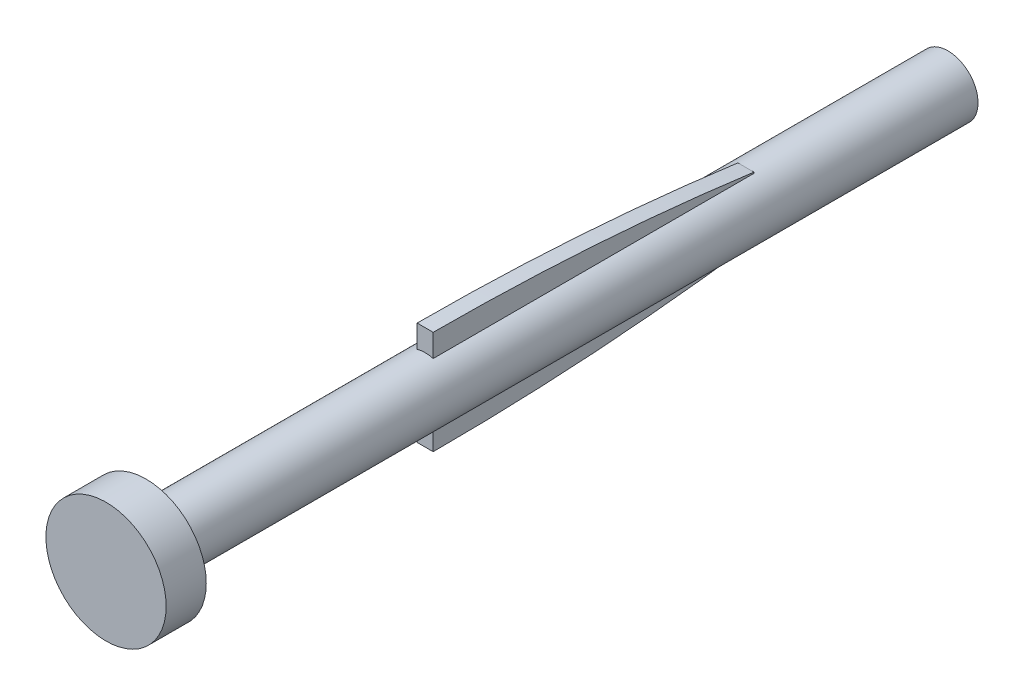
ISO-10303-21;
HEADER;
FILE_DESCRIPTION(('STEP AP214'),'2;1');
FILE_NAME('part.step','',(''),(''),'','','');
FILE_SCHEMA(('AUTOMOTIVE_DESIGN { 1 0 10303 214 1 1 1 1 }'));
ENDSEC;
DATA;
#1=APPLICATION_CONTEXT('core data for automotive mechanical design processes');
#2=APPLICATION_PROTOCOL_DEFINITION('international standard','automotive_design',2000,#1);
#3=PRODUCT_CONTEXT('',#1,'mechanical');
#4=PRODUCT('Part','Part','',(#3));
#5=PRODUCT_RELATED_PRODUCT_CATEGORY('part','',(#4));
#6=PRODUCT_DEFINITION_FORMATION('','',#4);
#7=PRODUCT_DEFINITION_CONTEXT('part definition',#1,'design');
#8=PRODUCT_DEFINITION('design','',#6,#7);
#9=PRODUCT_DEFINITION_SHAPE('','',#8);
#10=(LENGTH_UNIT() NAMED_UNIT(*) SI_UNIT(.MILLI.,.METRE.));
#11=(NAMED_UNIT(*) PLANE_ANGLE_UNIT() SI_UNIT($,.RADIAN.));
#12=(NAMED_UNIT(*) SI_UNIT($,.STERADIAN.) SOLID_ANGLE_UNIT());
#13=UNCERTAINTY_MEASURE_WITH_UNIT(LENGTH_MEASURE(1.E-05),#10,'distance_accuracy_value','');
#14=(GEOMETRIC_REPRESENTATION_CONTEXT(3) GLOBAL_UNCERTAINTY_ASSIGNED_CONTEXT((#13)) GLOBAL_UNIT_ASSIGNED_CONTEXT((#10,
#11,#12)) REPRESENTATION_CONTEXT('',''));
#15=CARTESIAN_POINT('',(0.,0.,0.));
#16=DIRECTION('',(0.,0.,1.));
#17=DIRECTION('',(1.,0.,0.));
#18=AXIS2_PLACEMENT_3D('',#15,#16,#17);
#19=CARTESIAN_POINT('',(0.,0.,6.35));
#20=DIRECTION('',(0.,0.,-1.));
#21=DIRECTION('',(-1.,0.,0.));
#22=AXIS2_PLACEMENT_3D('',#19,#20,#21);
#23=CYLINDRICAL_SURFACE('',#22,9.525);
#24=CARTESIAN_POINT('',(0.,0.,6.35));
#25=DIRECTION('',(0.,0.,1.));
#26=DIRECTION('',(1.,0.,0.));
#27=AXIS2_PLACEMENT_3D('',#24,#25,#26);
#28=CIRCLE('',#27,9.525);
#29=CARTESIAN_POINT('',(9.525,0.,6.35));
#30=VERTEX_POINT('',#29);
#31=EDGE_CURVE('E187',#30,#30,#28,.T.);
#32=ORIENTED_EDGE('',*,*,#31,.F.);
#33=EDGE_LOOP('',(#32));
#34=FACE_BOUND('',#33,.T.);
#35=CARTESIAN_POINT('',(0.,0.,0.));
#36=DIRECTION('',(0.,0.,1.));
#37=DIRECTION('',(1.,0.,0.));
#38=AXIS2_PLACEMENT_3D('',#35,#36,#37);
#39=CIRCLE('',#38,9.525);
#40=CARTESIAN_POINT('',(9.525,0.,0.));
#41=VERTEX_POINT('',#40);
#42=EDGE_CURVE('E181',#41,#41,#39,.T.);
#43=ORIENTED_EDGE('',*,*,#42,.T.);
#44=EDGE_LOOP('',(#43));
#45=FACE_BOUND('',#44,.T.);
#46=ADVANCED_FACE('F39',(#34,#45),#23,.T.);
#47=CARTESIAN_POINT('',(0.,0.,6.35));
#48=DIRECTION('',(0.,0.,1.));
#49=DIRECTION('',(1.,0.,0.));
#50=AXIS2_PLACEMENT_3D('',#47,#48,#49);
#51=PLANE('',#50);
#52=ORIENTED_EDGE('',*,*,#31,.T.);
#53=EDGE_LOOP('',(#52));
#54=FACE_BOUND('',#53,.T.);
#55=ADVANCED_FACE('F260',(#54),#51,.T.);
#56=CARTESIAN_POINT('',(0.,0.,0.));
#57=DIRECTION('',(0.,0.,1.));
#58=DIRECTION('',(1.,0.,0.));
#59=AXIS2_PLACEMENT_3D('',#56,#57,#58);
#60=PLANE('',#59);
#61=CARTESIAN_POINT('',(0.,0.,0.));
#62=DIRECTION('',(0.,0.,-1.));
#63=DIRECTION('',(-1.,0.,0.));
#64=AXIS2_PLACEMENT_3D('',#61,#62,#63);
#65=CIRCLE('',#64,4.7625);
#66=CARTESIAN_POINT('',(-4.7625,0.,0.));
#67=VERTEX_POINT('',#66);
#68=EDGE_CURVE('E182',#67,#67,#65,.T.);
#69=ORIENTED_EDGE('',*,*,#68,.F.);
#70=EDGE_LOOP('',(#69));
#71=FACE_BOUND('',#70,.T.);
#72=ORIENTED_EDGE('',*,*,#42,.F.);
#73=EDGE_LOOP('',(#72));
#74=FACE_BOUND('',#73,.T.);
#75=ADVANCED_FACE('F265',(#71,#74),#60,.F.);
#76=CARTESIAN_POINT('',(0.,0.,-127.));
#77=DIRECTION('',(0.,0.,1.));
#78=DIRECTION('',(1.,0.,0.));
#79=AXIS2_PLACEMENT_3D('',#76,#77,#78);
#80=CYLINDRICAL_SURFACE('',#79,4.7625);
#81=CARTESIAN_POINT('',(0.,0.,-94.996));
#82=DIRECTION('',(0.,0.,-1.));
#83=DIRECTION('',(-1.,0.,0.));
#84=AXIS2_PLACEMENT_3D('',#81,#82,#83);
#85=CIRCLE('',#84,4.7625);
#86=CARTESIAN_POINT('',(1.27,-4.5900442535993,-94.996));
#87=VERTEX_POINT('',#86);
#88=CARTESIAN_POINT('',(0.,-4.7625,-94.996));
#89=VERTEX_POINT('',#88);
#90=EDGE_CURVE('E49',#87,#89,#85,.T.);
#91=ORIENTED_EDGE('',*,*,#90,.T.);
#92=CARTESIAN_POINT('',(-1.27,-4.5900442535993,-94.996));
#93=VERTEX_POINT('',#92);
#94=EDGE_CURVE('E11',#89,#93,#85,.T.);
#95=ORIENTED_EDGE('',*,*,#94,.T.);
#96=DIRECTION('',(0.,0.,1.));
#97=VECTOR('',#96,1.);
#98=CARTESIAN_POINT('',(-1.27,-4.5900442535993,-127.));
#99=LINE('',#98,#97);
#100=CARTESIAN_POINT('',(-1.27,-4.5900442535993,-44.196));
#101=VERTEX_POINT('',#100);
#102=EDGE_CURVE('E42',#93,#101,#99,.T.);
#103=ORIENTED_EDGE('',*,*,#102,.T.);
#104=CARTESIAN_POINT('',(0.,0.,-44.196));
#105=DIRECTION('',(0.,0.,1.));
#106=DIRECTION('',(0.,-1.,0.));
#107=AXIS2_PLACEMENT_3D('',#104,#105,#106);
#108=CIRCLE('',#107,4.7625);
#109=CARTESIAN_POINT('',(1.27,-4.5900442535993,-44.196));
#110=VERTEX_POINT('',#109);
#111=EDGE_CURVE('E197',#101,#110,#108,.T.);
#112=ORIENTED_EDGE('',*,*,#111,.T.);
#113=DIRECTION('',(0.,0.,1.));
#114=VECTOR('',#113,1.);
#115=CARTESIAN_POINT('',(1.27,-4.5900442535993,-127.));
#116=LINE('',#115,#114);
#117=EDGE_CURVE('E203',#87,#110,#116,.T.);
#118=ORIENTED_EDGE('',*,*,#117,.F.);
#119=EDGE_LOOP('',(#91,#95,#103,#112,#118));
#120=FACE_BOUND('',#119,.T.);
#121=CARTESIAN_POINT('',(1.27,4.5900442535993,-44.196));
#122=VERTEX_POINT('',#121);
#123=CARTESIAN_POINT('',(-1.27,4.5900442535993,-44.196));
#124=VERTEX_POINT('',#123);
#125=EDGE_CURVE('E128',#122,#124,#108,.T.);
#126=ORIENTED_EDGE('',*,*,#125,.T.);
#127=DIRECTION('',(0.,0.,1.));
#128=VECTOR('',#127,1.);
#129=CARTESIAN_POINT('',(-1.27,4.5900442535993,-127.));
#130=LINE('',#129,#128);
#131=CARTESIAN_POINT('',(-1.27,4.5900442535993,-94.996));
#132=VERTEX_POINT('',#131);
#133=EDGE_CURVE('E201',#124,#132,#130,.F.);
#134=ORIENTED_EDGE('',*,*,#133,.T.);
#135=CARTESIAN_POINT('',(0.,4.7625,-94.996));
#136=VERTEX_POINT('',#135);
#137=EDGE_CURVE('E200',#132,#136,#85,.T.);
#138=ORIENTED_EDGE('',*,*,#137,.T.);
#139=CARTESIAN_POINT('',(1.27,4.5900442535993,-94.996));
#140=VERTEX_POINT('',#139);
#141=EDGE_CURVE('E50',#136,#140,#85,.T.);
#142=ORIENTED_EDGE('',*,*,#141,.T.);
#143=DIRECTION('',(0.,0.,1.));
#144=VECTOR('',#143,1.);
#145=CARTESIAN_POINT('',(1.27,4.5900442535993,-127.));
#146=LINE('',#145,#144);
#147=EDGE_CURVE('E186',#122,#140,#146,.F.);
#148=ORIENTED_EDGE('',*,*,#147,.F.);
#149=EDGE_LOOP('',(#126,#134,#138,#142,#148));
#150=FACE_BOUND('',#149,.T.);
#151=CARTESIAN_POINT('',(0.,0.,-127.));
#152=DIRECTION('',(0.,0.,-1.));
#153=DIRECTION('',(-1.,0.,0.));
#154=AXIS2_PLACEMENT_3D('',#151,#152,#153);
#155=CIRCLE('',#154,4.7625);
#156=CARTESIAN_POINT('',(-4.7625,0.,-127.));
#157=VERTEX_POINT('',#156);
#158=EDGE_CURVE('E168',#157,#157,#155,.T.);
#159=ORIENTED_EDGE('',*,*,#158,.F.);
#160=EDGE_LOOP('',(#159));
#161=FACE_BOUND('',#160,.T.);
#162=ORIENTED_EDGE('',*,*,#68,.T.);
#163=EDGE_LOOP('',(#162));
#164=FACE_BOUND('',#163,.T.);
#165=ADVANCED_FACE('F216',(#120,#150,#161,#164),#80,.T.);
#166=CARTESIAN_POINT('',(0.,0.,-127.));
#167=DIRECTION('',(0.,0.,-1.));
#168=DIRECTION('',(-1.,0.,0.));
#169=AXIS2_PLACEMENT_3D('',#166,#167,#168);
#170=PLANE('',#169);
#171=ORIENTED_EDGE('',*,*,#158,.T.);
#172=EDGE_LOOP('',(#171));
#173=FACE_BOUND('',#172,.T.);
#174=ADVANCED_FACE('F277',(#173),#170,.T.);
#175=CARTESIAN_POINT('',(-1.27,-369.819296296295,-44.196));
#176=DIRECTION('',(1.,0.,0.));
#177=DIRECTION('',(0.,0.,-1.));
#178=AXIS2_PLACEMENT_3D('',#175,#176,#177);
#179=CYLINDRICAL_SURFACE('',#178,378.010796296295);
#180=DIRECTION('',(1.,0.,0.));
#181=VECTOR('',#180,1.);
#182=CARTESIAN_POINT('',(-1.27,8.1915,-44.196));
#183=LINE('',#182,#181);
#184=CARTESIAN_POINT('',(-1.27,8.1915,-44.196));
#185=VERTEX_POINT('',#184);
#186=CARTESIAN_POINT('',(1.27,8.1915,-44.196));
#187=VERTEX_POINT('',#186);
#188=EDGE_CURVE('E108',#185,#187,#183,.T.);
#189=ORIENTED_EDGE('',*,*,#188,.T.);
#190=CARTESIAN_POINT('',(1.27,-369.819296296295,-44.196));
#191=DIRECTION('',(1.,0.,0.));
#192=DIRECTION('',(0.,0.,1.));
#193=AXIS2_PLACEMENT_3D('',#190,#191,#192);
#194=CIRCLE('',#193,378.010796296295);
#195=CARTESIAN_POINT('',(1.27,4.7625,-94.996));
#196=VERTEX_POINT('',#195);
#197=EDGE_CURVE('E113',#196,#187,#194,.T.);
#198=ORIENTED_EDGE('',*,*,#197,.F.);
#199=DIRECTION('',(1.,0.,0.));
#200=VECTOR('',#199,1.);
#201=CARTESIAN_POINT('',(-1.27,4.7625,-94.996));
#202=LINE('',#201,#200);
#203=EDGE_CURVE('E169',#136,#196,#202,.T.);
#204=ORIENTED_EDGE('',*,*,#203,.F.);
#205=CARTESIAN_POINT('',(-1.27,4.7625,-94.996));
#206=VERTEX_POINT('',#205);
#207=EDGE_CURVE('E164',#206,#136,#202,.T.);
#208=ORIENTED_EDGE('',*,*,#207,.F.);
#209=CARTESIAN_POINT('',(-1.27,-369.819296296295,-44.196));
#210=DIRECTION('',(1.,0.,0.));
#211=DIRECTION('',(0.,0.,1.));
#212=AXIS2_PLACEMENT_3D('',#209,#210,#211);
#213=CIRCLE('',#212,378.010796296295);
#214=EDGE_CURVE('E116',#206,#185,#213,.T.);
#215=ORIENTED_EDGE('',*,*,#214,.T.);
#216=EDGE_LOOP('',(#189,#198,#204,#208,#215));
#217=FACE_BOUND('',#216,.T.);
#218=ADVANCED_FACE('F110',(#217),#179,.T.);
#219=CARTESIAN_POINT('',(-1.27,-369.819296296295,-44.196));
#220=DIRECTION('',(-1.,0.,0.));
#221=DIRECTION('',(0.,0.,1.));
#222=AXIS2_PLACEMENT_3D('',#219,#220,#221);
#223=PLANE('',#222);
#224=ORIENTED_EDGE('',*,*,#133,.F.);
#225=DIRECTION('',(0.,-1.,0.));
#226=VECTOR('',#225,1.);
#227=CARTESIAN_POINT('',(-1.27,4.7625,-44.196));
#228=LINE('',#227,#226);
#229=EDGE_CURVE('E153',#185,#124,#228,.T.);
#230=ORIENTED_EDGE('',*,*,#229,.F.);
#231=ORIENTED_EDGE('',*,*,#214,.F.);
#232=DIRECTION('',(0.,1.,0.));
#233=VECTOR('',#232,1.);
#234=CARTESIAN_POINT('',(-1.27,4.7625,-94.996));
#235=LINE('',#234,#233);
#236=EDGE_CURVE('E160',#132,#206,#235,.T.);
#237=ORIENTED_EDGE('',*,*,#236,.F.);
#238=EDGE_LOOP('',(#224,#230,#231,#237));
#239=FACE_BOUND('',#238,.T.);
#240=ADVANCED_FACE('F255',(#239),#223,.T.);
#241=CARTESIAN_POINT('',(1.27,-369.819296296295,-44.196));
#242=DIRECTION('',(-1.,0.,0.));
#243=DIRECTION('',(0.,0.,1.));
#244=AXIS2_PLACEMENT_3D('',#241,#242,#243);
#245=PLANE('',#244);
#246=DIRECTION('',(0.,-1.,0.));
#247=VECTOR('',#246,1.);
#248=CARTESIAN_POINT('',(1.27,4.7625,-44.196));
#249=LINE('',#248,#247);
#250=EDGE_CURVE('E126',#187,#122,#249,.T.);
#251=ORIENTED_EDGE('',*,*,#250,.T.);
#252=ORIENTED_EDGE('',*,*,#147,.T.);
#253=DIRECTION('',(0.,1.,0.));
#254=VECTOR('',#253,1.);
#255=CARTESIAN_POINT('',(1.27,4.7625,-94.996));
#256=LINE('',#255,#254);
#257=EDGE_CURVE('E138',#140,#196,#256,.T.);
#258=ORIENTED_EDGE('',*,*,#257,.T.);
#259=ORIENTED_EDGE('',*,*,#197,.T.);
#260=EDGE_LOOP('',(#251,#252,#258,#259));
#261=FACE_BOUND('',#260,.T.);
#262=ADVANCED_FACE('F136',(#261),#245,.F.);
#263=CARTESIAN_POINT('',(-1.27,-4.7625,-44.196));
#264=DIRECTION('',(0.,0.,1.));
#265=DIRECTION('',(0.,-1.,0.));
#266=AXIS2_PLACEMENT_3D('',#263,#264,#265);
#267=PLANE('',#266);
#268=ORIENTED_EDGE('',*,*,#125,.F.);
#269=ORIENTED_EDGE('',*,*,#250,.F.);
#270=ORIENTED_EDGE('',*,*,#188,.F.);
#271=ORIENTED_EDGE('',*,*,#229,.T.);
#272=EDGE_LOOP('',(#268,#269,#270,#271));
#273=FACE_BOUND('',#272,.T.);
#274=ADVANCED_FACE('F127',(#273),#267,.T.);
#275=CARTESIAN_POINT('',(-1.27,4.7625,-94.996));
#276=DIRECTION('',(0.,0.,-1.));
#277=DIRECTION('',(-1.,0.,0.));
#278=AXIS2_PLACEMENT_3D('',#275,#276,#277);
#279=PLANE('',#278);
#280=ORIENTED_EDGE('',*,*,#141,.F.);
#281=ORIENTED_EDGE('',*,*,#203,.T.);
#282=ORIENTED_EDGE('',*,*,#257,.F.);
#283=EDGE_LOOP('',(#280,#281,#282));
#284=FACE_BOUND('',#283,.T.);
#285=ADVANCED_FACE('F222',(#284),#279,.T.);
#286=ORIENTED_EDGE('',*,*,#137,.F.);
#287=ORIENTED_EDGE('',*,*,#236,.T.);
#288=ORIENTED_EDGE('',*,*,#207,.T.);
#289=EDGE_LOOP('',(#286,#287,#288));
#290=FACE_BOUND('',#289,.T.);
#291=ADVANCED_FACE('F224',(#290),#279,.T.);
#292=ORIENTED_EDGE('',*,*,#90,.F.);
#293=CARTESIAN_POINT('',(1.27,-4.7625,-94.996));
#294=VERTEX_POINT('',#293);
#295=EDGE_CURVE('E146',#294,#87,#256,.T.);
#296=ORIENTED_EDGE('',*,*,#295,.F.);
#297=DIRECTION('',(1.,0.,0.));
#298=VECTOR('',#297,1.);
#299=CARTESIAN_POINT('',(-1.27,-4.7625,-94.996));
#300=LINE('',#299,#298);
#301=EDGE_CURVE('E174',#89,#294,#300,.T.);
#302=ORIENTED_EDGE('',*,*,#301,.F.);
#303=EDGE_LOOP('',(#292,#296,#302));
#304=FACE_BOUND('',#303,.T.);
#305=ADVANCED_FACE('F247',(#304),#279,.T.);
#306=ORIENTED_EDGE('',*,*,#102,.F.);
#307=CARTESIAN_POINT('',(-1.27,-4.7625,-94.996));
#308=VERTEX_POINT('',#307);
#309=EDGE_CURVE('E122',#308,#93,#235,.T.);
#310=ORIENTED_EDGE('',*,*,#309,.F.);
#311=CARTESIAN_POINT('',(-1.27,369.819296296295,-44.196));
#312=DIRECTION('',(1.,0.,0.));
#313=DIRECTION('',(0.,0.,-1.));
#314=AXIS2_PLACEMENT_3D('',#311,#312,#313);
#315=CIRCLE('',#314,378.010796296295);
#316=CARTESIAN_POINT('',(-1.27,-8.1915,-44.196));
#317=VERTEX_POINT('',#316);
#318=EDGE_CURVE('E156',#317,#308,#315,.T.);
#319=ORIENTED_EDGE('',*,*,#318,.F.);
#320=EDGE_CURVE('E152',#101,#317,#228,.T.);
#321=ORIENTED_EDGE('',*,*,#320,.F.);
#322=EDGE_LOOP('',(#306,#310,#319,#321));
#323=FACE_BOUND('',#322,.T.);
#324=ADVANCED_FACE('F239',(#323),#223,.T.);
#325=ORIENTED_EDGE('',*,*,#295,.T.);
#326=ORIENTED_EDGE('',*,*,#117,.T.);
#327=CARTESIAN_POINT('',(1.27,-8.1915,-44.196));
#328=VERTEX_POINT('',#327);
#329=EDGE_CURVE('E133',#110,#328,#249,.T.);
#330=ORIENTED_EDGE('',*,*,#329,.T.);
#331=CARTESIAN_POINT('',(1.27,369.819296296295,-44.196));
#332=DIRECTION('',(1.,0.,0.));
#333=DIRECTION('',(0.,0.,-1.));
#334=AXIS2_PLACEMENT_3D('',#331,#332,#333);
#335=CIRCLE('',#334,378.010796296295);
#336=EDGE_CURVE('E132',#328,#294,#335,.T.);
#337=ORIENTED_EDGE('',*,*,#336,.T.);
#338=EDGE_LOOP('',(#325,#326,#330,#337));
#339=FACE_BOUND('',#338,.T.);
#340=ADVANCED_FACE('F246',(#339),#245,.F.);
#341=ORIENTED_EDGE('',*,*,#94,.F.);
#342=EDGE_CURVE('E170',#308,#89,#300,.T.);
#343=ORIENTED_EDGE('',*,*,#342,.F.);
#344=ORIENTED_EDGE('',*,*,#309,.T.);
#345=EDGE_LOOP('',(#341,#343,#344));
#346=FACE_BOUND('',#345,.T.);
#347=ADVANCED_FACE('F241',(#346),#279,.T.);
#348=CARTESIAN_POINT('',(-1.27,369.819296296295,-44.196));
#349=DIRECTION('',(1.,0.,0.));
#350=DIRECTION('',(0.,0.,-1.));
#351=AXIS2_PLACEMENT_3D('',#348,#349,#350);
#352=CYLINDRICAL_SURFACE('',#351,378.010796296295);
#353=ORIENTED_EDGE('',*,*,#342,.T.);
#354=ORIENTED_EDGE('',*,*,#301,.T.);
#355=ORIENTED_EDGE('',*,*,#336,.F.);
#356=DIRECTION('',(1.,0.,0.));
#357=VECTOR('',#356,1.);
#358=CARTESIAN_POINT('',(-1.27,-8.1915,-44.196));
#359=LINE('',#358,#357);
#360=EDGE_CURVE('E121',#317,#328,#359,.T.);
#361=ORIENTED_EDGE('',*,*,#360,.F.);
#362=ORIENTED_EDGE('',*,*,#318,.T.);
#363=EDGE_LOOP('',(#353,#354,#355,#361,#362));
#364=FACE_BOUND('',#363,.T.);
#365=ADVANCED_FACE('F237',(#364),#352,.T.);
#366=ORIENTED_EDGE('',*,*,#111,.F.);
#367=ORIENTED_EDGE('',*,*,#320,.T.);
#368=ORIENTED_EDGE('',*,*,#360,.T.);
#369=ORIENTED_EDGE('',*,*,#329,.F.);
#370=EDGE_LOOP('',(#366,#367,#368,#369));
#371=FACE_BOUND('',#370,.T.);
#372=ADVANCED_FACE('F232',(#371),#267,.T.);
#373=CLOSED_SHELL('',(#46,#55,#75,#165,#174,#218,#240,#262,#274,#285,#291,#305,#324,#340,#347,
#365,#372));
#374=MANIFOLD_SOLID_BREP('B2',#373);
#375=ADVANCED_BREP_SHAPE_REPRESENTATION('',(#18,#374),#14);
#376=SHAPE_DEFINITION_REPRESENTATION(#9,#375);
ENDSEC;
END-ISO-10303-21;
